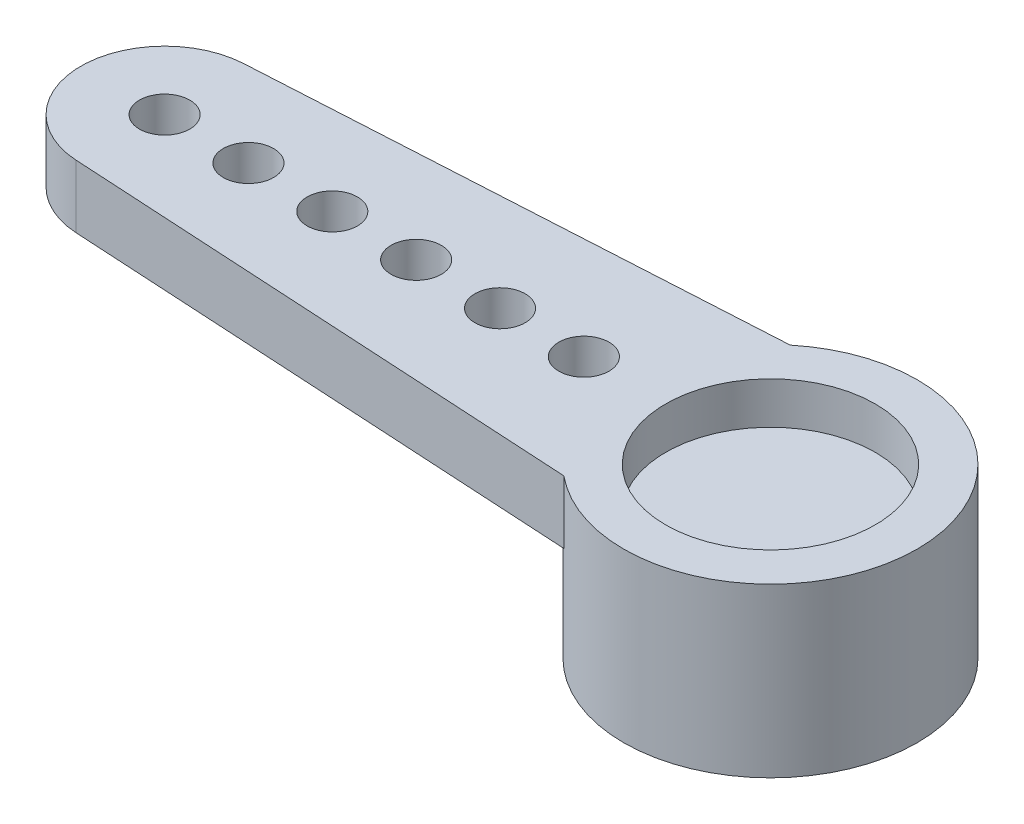
ISO-10303-21;
HEADER;
FILE_DESCRIPTION(('STEP AP214'),'2;1');
FILE_NAME('part.step','',(''),(''),'','','');
FILE_SCHEMA(('AUTOMOTIVE_DESIGN { 1 0 10303 214 1 1 1 1 }'));
ENDSEC;
DATA;
#1=APPLICATION_CONTEXT('core data for automotive mechanical design processes');
#2=APPLICATION_PROTOCOL_DEFINITION('international standard','automotive_design',2000,#1);
#3=PRODUCT_CONTEXT('',#1,'mechanical');
#4=PRODUCT('Part','Part','',(#3));
#5=PRODUCT_RELATED_PRODUCT_CATEGORY('part','',(#4));
#6=PRODUCT_DEFINITION_FORMATION('','',#4);
#7=PRODUCT_DEFINITION_CONTEXT('part definition',#1,'design');
#8=PRODUCT_DEFINITION('design','',#6,#7);
#9=PRODUCT_DEFINITION_SHAPE('','',#8);
#10=(LENGTH_UNIT() NAMED_UNIT(*) SI_UNIT(.MILLI.,.METRE.));
#11=(NAMED_UNIT(*) PLANE_ANGLE_UNIT() SI_UNIT($,.RADIAN.));
#12=(NAMED_UNIT(*) SI_UNIT($,.STERADIAN.) SOLID_ANGLE_UNIT());
#13=UNCERTAINTY_MEASURE_WITH_UNIT(LENGTH_MEASURE(1.E-05),#10,'distance_accuracy_value','');
#14=(GEOMETRIC_REPRESENTATION_CONTEXT(3) GLOBAL_UNCERTAINTY_ASSIGNED_CONTEXT((#13)) GLOBAL_UNIT_ASSIGNED_CONTEXT((#10,
#11,#12)) REPRESENTATION_CONTEXT('',''));
#15=CARTESIAN_POINT('',(0.,0.,0.));
#16=DIRECTION('',(0.,0.,1.));
#17=DIRECTION('',(1.,0.,0.));
#18=AXIS2_PLACEMENT_3D('',#15,#16,#17);
#19=CARTESIAN_POINT('',(16.3,25.5,-6.));
#20=DIRECTION('',(0.,1.,0.));
#21=DIRECTION('',(0.,0.,1.));
#22=AXIS2_PLACEMENT_3D('',#19,#20,#21);
#23=CYLINDRICAL_SURFACE('',#22,2.5);
#24=CARTESIAN_POINT('',(16.3,25.5,-6.));
#25=DIRECTION('',(0.,1.,0.));
#26=DIRECTION('',(0.,0.,1.));
#27=AXIS2_PLACEMENT_3D('',#24,#25,#26);
#28=CIRCLE('',#27,2.5);
#29=CARTESIAN_POINT('',(16.3,25.5,-3.5));
#30=VERTEX_POINT('',#29);
#31=EDGE_CURVE('E51',#30,#30,#28,.T.);
#32=ORIENTED_EDGE('',*,*,#31,.F.);
#33=EDGE_LOOP('',(#32));
#34=FACE_BOUND('',#33,.T.);
#35=CARTESIAN_POINT('',(16.3,27.5,-6.));
#36=DIRECTION('',(0.,1.,0.));
#37=DIRECTION('',(0.,0.,1.));
#38=AXIS2_PLACEMENT_3D('',#35,#36,#37);
#39=CIRCLE('',#38,2.5);
#40=CARTESIAN_POINT('',(16.3,27.5,-3.5));
#41=VERTEX_POINT('',#40);
#42=EDGE_CURVE('E11',#41,#41,#39,.F.);
#43=ORIENTED_EDGE('',*,*,#42,.F.);
#44=EDGE_LOOP('',(#43));
#45=FACE_BOUND('',#44,.T.);
#46=ADVANCED_FACE('F43',(#34,#45),#23,.F.);
#47=CARTESIAN_POINT('',(16.3,25.5,-6.));
#48=DIRECTION('',(0.,1.,0.));
#49=DIRECTION('',(0.,0.,1.));
#50=AXIS2_PLACEMENT_3D('',#47,#48,#49);
#51=CYLINDRICAL_SURFACE('',#50,3.5);
#52=CARTESIAN_POINT('',(16.3,29.5,-6.));
#53=DIRECTION('',(0.,1.,0.));
#54=DIRECTION('',(0.,0.,1.));
#55=AXIS2_PLACEMENT_3D('',#52,#53,#54);
#56=CIRCLE('',#55,3.5);
#57=CARTESIAN_POINT('',(14.072894254868,29.5,-8.7));
#58=VERTEX_POINT('',#57);
#59=CARTESIAN_POINT('',(14.072894254868,29.5,-3.3));
#60=VERTEX_POINT('',#59);
#61=EDGE_CURVE('E135',#58,#60,#56,.F.);
#62=ORIENTED_EDGE('',*,*,#61,.T.);
#63=DIRECTION('',(0.,1.,0.));
#64=VECTOR('',#63,1.);
#65=CARTESIAN_POINT('',(14.072894254868,28.,-3.3));
#66=LINE('',#65,#64);
#67=CARTESIAN_POINT('',(14.072894254868,28.,-3.3));
#68=VERTEX_POINT('',#67);
#69=EDGE_CURVE('E58',#68,#60,#66,.T.);
#70=ORIENTED_EDGE('',*,*,#69,.F.);
#71=CARTESIAN_POINT('',(16.3,28.,-6.));
#72=DIRECTION('',(0.,1.,0.));
#73=DIRECTION('',(0.,0.,1.));
#74=AXIS2_PLACEMENT_3D('',#71,#72,#73);
#75=CIRCLE('',#74,3.5);
#76=CARTESIAN_POINT('',(14.072894254868,28.,-8.7));
#77=VERTEX_POINT('',#76);
#78=EDGE_CURVE('E62',#68,#77,#75,.F.);
#79=ORIENTED_EDGE('',*,*,#78,.T.);
#80=DIRECTION('',(0.,1.,0.));
#81=VECTOR('',#80,1.);
#82=CARTESIAN_POINT('',(14.072894254868,28.,-8.7));
#83=LINE('',#82,#81);
#84=EDGE_CURVE('E94',#77,#58,#83,.T.);
#85=ORIENTED_EDGE('',*,*,#84,.T.);
#86=EDGE_LOOP('',(#62,#70,#79,#85));
#87=FACE_BOUND('',#86,.T.);
#88=CARTESIAN_POINT('',(16.3,25.5,-6.));
#89=DIRECTION('',(0.,1.,0.));
#90=DIRECTION('',(0.,0.,1.));
#91=AXIS2_PLACEMENT_3D('',#88,#89,#90);
#92=CIRCLE('',#91,3.5);
#93=CARTESIAN_POINT('',(16.3,25.5,-2.5));
#94=VERTEX_POINT('',#93);
#95=EDGE_CURVE('E138',#94,#94,#92,.F.);
#96=ORIENTED_EDGE('',*,*,#95,.F.);
#97=EDGE_LOOP('',(#96));
#98=FACE_BOUND('',#97,.T.);
#99=ADVANCED_FACE('F45',(#87,#98),#51,.T.);
#100=CARTESIAN_POINT('',(0.,25.5,0.));
#101=DIRECTION('',(0.,1.,0.));
#102=DIRECTION('',(0.,0.,1.));
#103=AXIS2_PLACEMENT_3D('',#100,#101,#102);
#104=PLANE('',#103);
#105=ORIENTED_EDGE('',*,*,#95,.T.);
#106=EDGE_LOOP('',(#105));
#107=FACE_BOUND('',#106,.T.);
#108=ORIENTED_EDGE('',*,*,#31,.T.);
#109=EDGE_LOOP('',(#108));
#110=FACE_BOUND('',#109,.T.);
#111=ADVANCED_FACE('F150',(#107,#110),#104,.F.);
#112=CARTESIAN_POINT('',(0.,29.5,0.));
#113=DIRECTION('',(0.,1.,0.));
#114=DIRECTION('',(0.,0.,1.));
#115=AXIS2_PLACEMENT_3D('',#112,#113,#114);
#116=PLANE('',#115);
#117=CARTESIAN_POINT('',(16.3,29.5,-6.));
#118=DIRECTION('',(0.,1.,0.));
#119=DIRECTION('',(0.,0.,1.));
#120=AXIS2_PLACEMENT_3D('',#117,#118,#119);
#121=CIRCLE('',#120,2.5);
#122=CARTESIAN_POINT('',(16.3,29.5,-3.5));
#123=VERTEX_POINT('',#122);
#124=EDGE_CURVE('E343',#123,#123,#121,.T.);
#125=ORIENTED_EDGE('',*,*,#124,.F.);
#126=EDGE_LOOP('',(#125));
#127=FACE_BOUND('',#126,.T.);
#128=ORIENTED_EDGE('',*,*,#61,.F.);
#129=DIRECTION('',(-0.998379224060126,0.,0.056911553880563));
#130=VECTOR('',#129,1.);
#131=CARTESIAN_POINT('',(-0.448746974595686,29.5,-7.87220916927348));
#132=LINE('',#131,#130);
#133=CARTESIAN_POINT('',(1.73617689223888,29.5,-7.99675844812025));
#134=VERTEX_POINT('',#133);
#135=EDGE_CURVE('E131',#58,#134,#132,.T.);
#136=ORIENTED_EDGE('',*,*,#135,.T.);
#137=CARTESIAN_POINT('',(1.85,29.5,-6.));
#138=DIRECTION('',(0.,1.,0.));
#139=DIRECTION('',(0.,0.,1.));
#140=AXIS2_PLACEMENT_3D('',#137,#138,#139);
#141=CIRCLE('',#140,2.);
#142=CARTESIAN_POINT('',(1.73617689223888,29.5,-4.00324155187975));
#143=VERTEX_POINT('',#142);
#144=EDGE_CURVE('E89',#134,#143,#141,.T.);
#145=ORIENTED_EDGE('',*,*,#144,.T.);
#146=DIRECTION('',(0.998379224060126,0.,0.0569115538805627));
#147=VECTOR('',#146,1.);
#148=CARTESIAN_POINT('',(0.233084781444303,29.5,-4.08892373114531));
#149=LINE('',#148,#147);
#150=EDGE_CURVE('E128',#143,#60,#149,.T.);
#151=ORIENTED_EDGE('',*,*,#150,.T.);
#152=EDGE_LOOP('',(#128,#136,#145,#151));
#153=FACE_BOUND('',#152,.T.);
#154=CARTESIAN_POINT('',(1.85,29.5,-6.));
#155=DIRECTION('',(0.,1.,0.));
#156=DIRECTION('',(0.,0.,1.));
#157=AXIS2_PLACEMENT_3D('',#154,#155,#156);
#158=CIRCLE('',#157,0.6);
#159=CARTESIAN_POINT('',(1.85,29.5,-5.4));
#160=VERTEX_POINT('',#159);
#161=EDGE_CURVE('E109',#160,#160,#158,.T.);
#162=ORIENTED_EDGE('',*,*,#161,.F.);
#163=EDGE_LOOP('',(#162));
#164=FACE_BOUND('',#163,.T.);
#165=CARTESIAN_POINT('',(5.85,29.5,-6.));
#166=DIRECTION('',(0.,1.,0.));
#167=DIRECTION('',(0.,0.,1.));
#168=AXIS2_PLACEMENT_3D('',#165,#166,#167);
#169=CIRCLE('',#168,0.6);
#170=CARTESIAN_POINT('',(5.85,29.5,-5.4));
#171=VERTEX_POINT('',#170);
#172=EDGE_CURVE('E112',#171,#171,#169,.T.);
#173=ORIENTED_EDGE('',*,*,#172,.F.);
#174=EDGE_LOOP('',(#173));
#175=FACE_BOUND('',#174,.T.);
#176=CARTESIAN_POINT('',(7.85,29.5,-6.));
#177=DIRECTION('',(0.,1.,0.));
#178=DIRECTION('',(0.,0.,1.));
#179=AXIS2_PLACEMENT_3D('',#176,#177,#178);
#180=CIRCLE('',#179,0.6);
#181=CARTESIAN_POINT('',(7.85,29.5,-5.4));
#182=VERTEX_POINT('',#181);
#183=EDGE_CURVE('E116',#182,#182,#180,.T.);
#184=ORIENTED_EDGE('',*,*,#183,.F.);
#185=EDGE_LOOP('',(#184));
#186=FACE_BOUND('',#185,.T.);
#187=CARTESIAN_POINT('',(9.85,29.5,-6.));
#188=DIRECTION('',(0.,1.,0.));
#189=DIRECTION('',(0.,0.,1.));
#190=AXIS2_PLACEMENT_3D('',#187,#188,#189);
#191=CIRCLE('',#190,0.6);
#192=CARTESIAN_POINT('',(9.85,29.5,-5.4));
#193=VERTEX_POINT('',#192);
#194=EDGE_CURVE('E119',#193,#193,#191,.T.);
#195=ORIENTED_EDGE('',*,*,#194,.F.);
#196=EDGE_LOOP('',(#195));
#197=FACE_BOUND('',#196,.T.);
#198=CARTESIAN_POINT('',(11.85,29.5,-6.));
#199=DIRECTION('',(0.,1.,0.));
#200=DIRECTION('',(0.,0.,1.));
#201=AXIS2_PLACEMENT_3D('',#198,#199,#200);
#202=CIRCLE('',#201,0.6);
#203=CARTESIAN_POINT('',(11.85,29.5,-5.4));
#204=VERTEX_POINT('',#203);
#205=EDGE_CURVE('E122',#204,#204,#202,.T.);
#206=ORIENTED_EDGE('',*,*,#205,.F.);
#207=EDGE_LOOP('',(#206));
#208=FACE_BOUND('',#207,.T.);
#209=CARTESIAN_POINT('',(3.85,29.5,-6.));
#210=DIRECTION('',(0.,1.,0.));
#211=DIRECTION('',(0.,0.,1.));
#212=AXIS2_PLACEMENT_3D('',#209,#210,#211);
#213=CIRCLE('',#212,0.6);
#214=CARTESIAN_POINT('',(3.85,29.5,-5.4));
#215=VERTEX_POINT('',#214);
#216=EDGE_CURVE('E125',#215,#215,#213,.T.);
#217=ORIENTED_EDGE('',*,*,#216,.F.);
#218=EDGE_LOOP('',(#217));
#219=FACE_BOUND('',#218,.T.);
#220=ADVANCED_FACE('F147',(#127,#153,#164,#175,#186,#197,#208,#219),#116,.T.);
#221=CARTESIAN_POINT('',(0.233084781444303,28.,-4.08892373114531));
#222=DIRECTION('',(-0.0569115538805627,0.,0.998379224060126));
#223=DIRECTION('',(0.998379224060126,0.,0.0569115538805627));
#224=AXIS2_PLACEMENT_3D('',#221,#222,#223);
#225=PLANE('',#224);
#226=ORIENTED_EDGE('',*,*,#150,.F.);
#227=DIRECTION('',(0.,1.,0.));
#228=VECTOR('',#227,1.);
#229=CARTESIAN_POINT('',(1.73617689223888,28.,-4.00324155187975));
#230=LINE('',#229,#228);
#231=CARTESIAN_POINT('',(1.73617689223888,28.,-4.00324155187975));
#232=VERTEX_POINT('',#231);
#233=EDGE_CURVE('E93',#232,#143,#230,.T.);
#234=ORIENTED_EDGE('',*,*,#233,.F.);
#235=DIRECTION('',(0.998379224060126,0.,0.0569115538805627));
#236=VECTOR('',#235,1.);
#237=CARTESIAN_POINT('',(0.233084781444303,28.,-4.08892373114531));
#238=LINE('',#237,#236);
#239=EDGE_CURVE('E104',#232,#68,#238,.T.);
#240=ORIENTED_EDGE('',*,*,#239,.T.);
#241=ORIENTED_EDGE('',*,*,#69,.T.);
#242=EDGE_LOOP('',(#226,#234,#240,#241));
#243=FACE_BOUND('',#242,.T.);
#244=ADVANCED_FACE('F146',(#243),#225,.T.);
#245=CARTESIAN_POINT('',(1.85,28.,-6.));
#246=DIRECTION('',(0.,1.,0.));
#247=DIRECTION('',(0.,0.,1.));
#248=AXIS2_PLACEMENT_3D('',#245,#246,#247);
#249=CYLINDRICAL_SURFACE('',#248,2.);
#250=ORIENTED_EDGE('',*,*,#144,.F.);
#251=DIRECTION('',(0.,1.,0.));
#252=VECTOR('',#251,1.);
#253=CARTESIAN_POINT('',(1.73617689223888,28.,-7.99675844812025));
#254=LINE('',#253,#252);
#255=CARTESIAN_POINT('',(1.73617689223888,28.,-7.99675844812025));
#256=VERTEX_POINT('',#255);
#257=EDGE_CURVE('E83',#256,#134,#254,.T.);
#258=ORIENTED_EDGE('',*,*,#257,.F.);
#259=CARTESIAN_POINT('',(1.85,28.,-6.));
#260=DIRECTION('',(0.,1.,0.));
#261=DIRECTION('',(0.,0.,1.));
#262=AXIS2_PLACEMENT_3D('',#259,#260,#261);
#263=CIRCLE('',#262,2.);
#264=EDGE_CURVE('E87',#256,#232,#263,.T.);
#265=ORIENTED_EDGE('',*,*,#264,.T.);
#266=ORIENTED_EDGE('',*,*,#233,.T.);
#267=EDGE_LOOP('',(#250,#258,#265,#266));
#268=FACE_BOUND('',#267,.T.);
#269=ADVANCED_FACE('F85',(#268),#249,.T.);
#270=CARTESIAN_POINT('',(-0.448746974595686,28.,-7.87220916927348));
#271=DIRECTION('',(-0.056911553880563,0.,-0.998379224060126));
#272=DIRECTION('',(-0.998379224060126,0.,0.0569115538805631));
#273=AXIS2_PLACEMENT_3D('',#270,#271,#272);
#274=PLANE('',#273);
#275=ORIENTED_EDGE('',*,*,#135,.F.);
#276=ORIENTED_EDGE('',*,*,#84,.F.);
#277=DIRECTION('',(-0.998379224060126,0.,0.056911553880563));
#278=VECTOR('',#277,1.);
#279=CARTESIAN_POINT('',(-0.448746974595686,28.,-7.87220916927348));
#280=LINE('',#279,#278);
#281=EDGE_CURVE('E97',#77,#256,#280,.T.);
#282=ORIENTED_EDGE('',*,*,#281,.T.);
#283=ORIENTED_EDGE('',*,*,#257,.T.);
#284=EDGE_LOOP('',(#275,#276,#282,#283));
#285=FACE_BOUND('',#284,.T.);
#286=ADVANCED_FACE('F98',(#285),#274,.T.);
#287=CARTESIAN_POINT('',(3.85,28.,-6.));
#288=DIRECTION('',(0.,1.,0.));
#289=DIRECTION('',(0.,0.,1.));
#290=AXIS2_PLACEMENT_3D('',#287,#288,#289);
#291=CYLINDRICAL_SURFACE('',#290,0.6);
#292=CARTESIAN_POINT('',(3.85,28.,-6.));
#293=DIRECTION('',(0.,1.,0.));
#294=DIRECTION('',(0.,0.,1.));
#295=AXIS2_PLACEMENT_3D('',#292,#293,#294);
#296=CIRCLE('',#295,0.6);
#297=CARTESIAN_POINT('',(3.85,28.,-5.4));
#298=VERTEX_POINT('',#297);
#299=EDGE_CURVE('E220',#298,#298,#296,.T.);
#300=ORIENTED_EDGE('',*,*,#299,.F.);
#301=EDGE_LOOP('',(#300));
#302=FACE_BOUND('',#301,.T.);
#303=ORIENTED_EDGE('',*,*,#216,.T.);
#304=EDGE_LOOP('',(#303));
#305=FACE_BOUND('',#304,.T.);
#306=ADVANCED_FACE('F165',(#302,#305),#291,.F.);
#307=CARTESIAN_POINT('',(11.85,28.,-6.));
#308=DIRECTION('',(0.,1.,0.));
#309=DIRECTION('',(0.,0.,1.));
#310=AXIS2_PLACEMENT_3D('',#307,#308,#309);
#311=CYLINDRICAL_SURFACE('',#310,0.6);
#312=CARTESIAN_POINT('',(11.85,28.,-6.));
#313=DIRECTION('',(0.,1.,0.));
#314=DIRECTION('',(0.,0.,1.));
#315=AXIS2_PLACEMENT_3D('',#312,#313,#314);
#316=CIRCLE('',#315,0.6);
#317=CARTESIAN_POINT('',(11.85,28.,-5.4));
#318=VERTEX_POINT('',#317);
#319=EDGE_CURVE('E216',#318,#318,#316,.T.);
#320=ORIENTED_EDGE('',*,*,#319,.F.);
#321=EDGE_LOOP('',(#320));
#322=FACE_BOUND('',#321,.T.);
#323=ORIENTED_EDGE('',*,*,#205,.T.);
#324=EDGE_LOOP('',(#323));
#325=FACE_BOUND('',#324,.T.);
#326=ADVANCED_FACE('F167',(#322,#325),#311,.F.);
#327=CARTESIAN_POINT('',(9.85,28.,-6.));
#328=DIRECTION('',(0.,1.,0.));
#329=DIRECTION('',(0.,0.,1.));
#330=AXIS2_PLACEMENT_3D('',#327,#328,#329);
#331=CYLINDRICAL_SURFACE('',#330,0.6);
#332=CARTESIAN_POINT('',(9.85,28.,-6.));
#333=DIRECTION('',(0.,1.,0.));
#334=DIRECTION('',(0.,0.,1.));
#335=AXIS2_PLACEMENT_3D('',#332,#333,#334);
#336=CIRCLE('',#335,0.6);
#337=CARTESIAN_POINT('',(9.85,28.,-5.4));
#338=VERTEX_POINT('',#337);
#339=EDGE_CURVE('E214',#338,#338,#336,.T.);
#340=ORIENTED_EDGE('',*,*,#339,.F.);
#341=EDGE_LOOP('',(#340));
#342=FACE_BOUND('',#341,.T.);
#343=ORIENTED_EDGE('',*,*,#194,.T.);
#344=EDGE_LOOP('',(#343));
#345=FACE_BOUND('',#344,.T.);
#346=ADVANCED_FACE('F175',(#342,#345),#331,.F.);
#347=CARTESIAN_POINT('',(7.85,28.,-6.));
#348=DIRECTION('',(0.,1.,0.));
#349=DIRECTION('',(0.,0.,1.));
#350=AXIS2_PLACEMENT_3D('',#347,#348,#349);
#351=CYLINDRICAL_SURFACE('',#350,0.6);
#352=CARTESIAN_POINT('',(7.85,28.,-6.));
#353=DIRECTION('',(0.,1.,0.));
#354=DIRECTION('',(0.,0.,1.));
#355=AXIS2_PLACEMENT_3D('',#352,#353,#354);
#356=CIRCLE('',#355,0.6);
#357=CARTESIAN_POINT('',(7.85,28.,-5.4));
#358=VERTEX_POINT('',#357);
#359=EDGE_CURVE('E217',#358,#358,#356,.T.);
#360=ORIENTED_EDGE('',*,*,#359,.F.);
#361=EDGE_LOOP('',(#360));
#362=FACE_BOUND('',#361,.T.);
#363=ORIENTED_EDGE('',*,*,#183,.T.);
#364=EDGE_LOOP('',(#363));
#365=FACE_BOUND('',#364,.T.);
#366=ADVANCED_FACE('F201',(#362,#365),#351,.F.);
#367=CARTESIAN_POINT('',(5.85,28.,-6.));
#368=DIRECTION('',(0.,1.,0.));
#369=DIRECTION('',(0.,0.,1.));
#370=AXIS2_PLACEMENT_3D('',#367,#368,#369);
#371=CYLINDRICAL_SURFACE('',#370,0.6);
#372=CARTESIAN_POINT('',(5.85,28.,-6.));
#373=DIRECTION('',(0.,1.,0.));
#374=DIRECTION('',(0.,0.,1.));
#375=AXIS2_PLACEMENT_3D('',#372,#373,#374);
#376=CIRCLE('',#375,0.6);
#377=CARTESIAN_POINT('',(5.85,28.,-5.4));
#378=VERTEX_POINT('',#377);
#379=EDGE_CURVE('E223',#378,#378,#376,.T.);
#380=ORIENTED_EDGE('',*,*,#379,.F.);
#381=EDGE_LOOP('',(#380));
#382=FACE_BOUND('',#381,.T.);
#383=ORIENTED_EDGE('',*,*,#172,.T.);
#384=EDGE_LOOP('',(#383));
#385=FACE_BOUND('',#384,.T.);
#386=ADVANCED_FACE('F197',(#382,#385),#371,.F.);
#387=CARTESIAN_POINT('',(1.85,28.,-6.));
#388=DIRECTION('',(0.,1.,0.));
#389=DIRECTION('',(0.,0.,1.));
#390=AXIS2_PLACEMENT_3D('',#387,#388,#389);
#391=CYLINDRICAL_SURFACE('',#390,0.6);
#392=CARTESIAN_POINT('',(1.85,28.,-6.));
#393=DIRECTION('',(0.,1.,0.));
#394=DIRECTION('',(0.,0.,1.));
#395=AXIS2_PLACEMENT_3D('',#392,#393,#394);
#396=CIRCLE('',#395,0.6);
#397=CARTESIAN_POINT('',(1.85,28.,-5.4));
#398=VERTEX_POINT('',#397);
#399=EDGE_CURVE('E134',#398,#398,#396,.T.);
#400=ORIENTED_EDGE('',*,*,#399,.F.);
#401=EDGE_LOOP('',(#400));
#402=FACE_BOUND('',#401,.T.);
#403=ORIENTED_EDGE('',*,*,#161,.T.);
#404=EDGE_LOOP('',(#403));
#405=FACE_BOUND('',#404,.T.);
#406=ADVANCED_FACE('F194',(#402,#405),#391,.F.);
#407=CARTESIAN_POINT('',(0.,28.,0.));
#408=DIRECTION('',(0.,1.,0.));
#409=DIRECTION('',(0.,0.,1.));
#410=AXIS2_PLACEMENT_3D('',#407,#408,#409);
#411=PLANE('',#410);
#412=ORIENTED_EDGE('',*,*,#399,.T.);
#413=EDGE_LOOP('',(#412));
#414=FACE_BOUND('',#413,.T.);
#415=ORIENTED_EDGE('',*,*,#379,.T.);
#416=EDGE_LOOP('',(#415));
#417=FACE_BOUND('',#416,.T.);
#418=ORIENTED_EDGE('',*,*,#359,.T.);
#419=EDGE_LOOP('',(#418));
#420=FACE_BOUND('',#419,.T.);
#421=ORIENTED_EDGE('',*,*,#339,.T.);
#422=EDGE_LOOP('',(#421));
#423=FACE_BOUND('',#422,.T.);
#424=ORIENTED_EDGE('',*,*,#319,.T.);
#425=EDGE_LOOP('',(#424));
#426=FACE_BOUND('',#425,.T.);
#427=ORIENTED_EDGE('',*,*,#299,.T.);
#428=EDGE_LOOP('',(#427));
#429=FACE_BOUND('',#428,.T.);
#430=ORIENTED_EDGE('',*,*,#239,.F.);
#431=ORIENTED_EDGE('',*,*,#264,.F.);
#432=ORIENTED_EDGE('',*,*,#281,.F.);
#433=ORIENTED_EDGE('',*,*,#78,.F.);
#434=EDGE_LOOP('',(#430,#431,#432,#433));
#435=FACE_BOUND('',#434,.T.);
#436=ADVANCED_FACE('F102',(#414,#417,#420,#423,#426,#429,#435),#411,.F.);
#437=CARTESIAN_POINT('',(0.,27.5,0.));
#438=DIRECTION('',(0.,1.,0.));
#439=DIRECTION('',(0.,0.,1.));
#440=AXIS2_PLACEMENT_3D('',#437,#438,#439);
#441=PLANE('',#440);
#442=ORIENTED_EDGE('',*,*,#42,.T.);
#443=EDGE_LOOP('',(#442));
#444=FACE_BOUND('',#443,.T.);
#445=ADVANCED_FACE('F231',(#444),#441,.F.);
#446=CARTESIAN_POINT('',(16.3,28.5,-6.));
#447=DIRECTION('',(0.,1.,0.));
#448=DIRECTION('',(0.,0.,1.));
#449=AXIS2_PLACEMENT_3D('',#446,#447,#448);
#450=CYLINDRICAL_SURFACE('',#449,2.5);
#451=CARTESIAN_POINT('',(16.3,28.5,-6.));
#452=DIRECTION('',(0.,1.,0.));
#453=DIRECTION('',(0.,0.,1.));
#454=AXIS2_PLACEMENT_3D('',#451,#452,#453);
#455=CIRCLE('',#454,2.5);
#456=CARTESIAN_POINT('',(16.3,28.5,-3.5));
#457=VERTEX_POINT('',#456);
#458=EDGE_CURVE('E113',#457,#457,#455,.T.);
#459=ORIENTED_EDGE('',*,*,#458,.F.);
#460=EDGE_LOOP('',(#459));
#461=FACE_BOUND('',#460,.T.);
#462=ORIENTED_EDGE('',*,*,#124,.T.);
#463=EDGE_LOOP('',(#462));
#464=FACE_BOUND('',#463,.T.);
#465=ADVANCED_FACE('F238',(#461,#464),#450,.F.);
#466=CARTESIAN_POINT('',(0.,28.5,0.));
#467=DIRECTION('',(0.,1.,0.));
#468=DIRECTION('',(0.,0.,1.));
#469=AXIS2_PLACEMENT_3D('',#466,#467,#468);
#470=PLANE('',#469);
#471=ORIENTED_EDGE('',*,*,#458,.T.);
#472=EDGE_LOOP('',(#471));
#473=FACE_BOUND('',#472,.T.);
#474=ADVANCED_FACE('F323',(#473),#470,.T.);
#475=CLOSED_SHELL('',(#46,#99,#111,#220,#244,#269,#286,#306,#326,#346,#366,#386,#406,#436,#445,
#465,#474));
#476=MANIFOLD_SOLID_BREP('B2',#475);
#477=ADVANCED_BREP_SHAPE_REPRESENTATION('',(#18,#476),#14);
#478=SHAPE_DEFINITION_REPRESENTATION(#9,#477);
ENDSEC;
END-ISO-10303-21;
